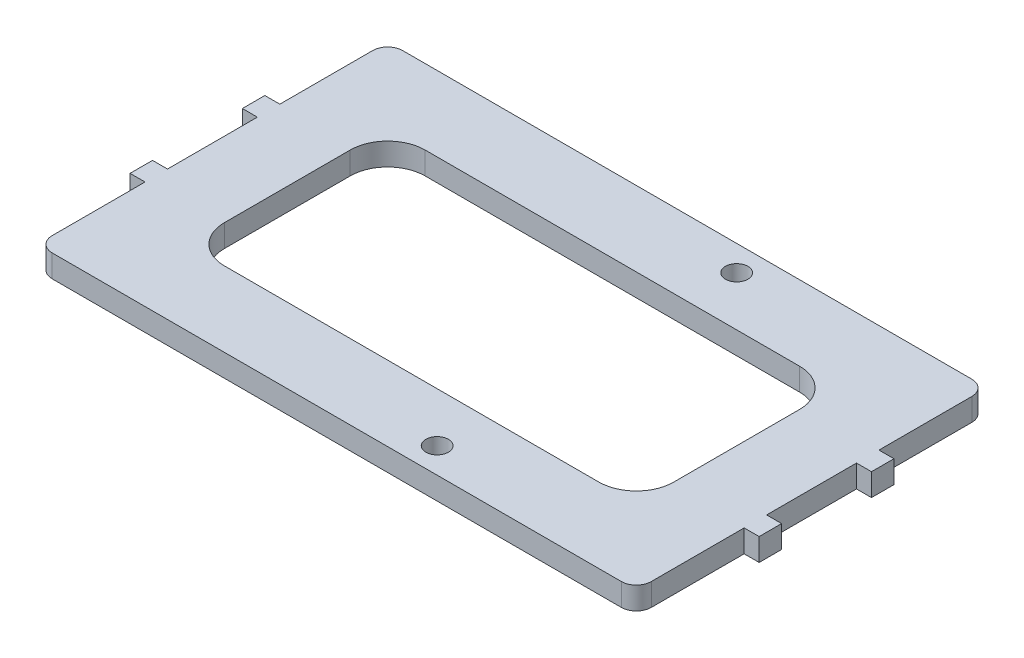
ISO-10303-21;
HEADER;
FILE_DESCRIPTION(('STEP AP214'),'2;1');
FILE_NAME('part.step','',(''),(''),'','','');
FILE_SCHEMA(('AUTOMOTIVE_DESIGN { 1 0 10303 214 1 1 1 1 }'));
ENDSEC;
DATA;
#1=APPLICATION_CONTEXT('core data for automotive mechanical design processes');
#2=APPLICATION_PROTOCOL_DEFINITION('international standard','automotive_design',2000,#1);
#3=PRODUCT_CONTEXT('',#1,'mechanical');
#4=PRODUCT('Part','Part','',(#3));
#5=PRODUCT_RELATED_PRODUCT_CATEGORY('part','',(#4));
#6=PRODUCT_DEFINITION_FORMATION('','',#4);
#7=PRODUCT_DEFINITION_CONTEXT('part definition',#1,'design');
#8=PRODUCT_DEFINITION('design','',#6,#7);
#9=PRODUCT_DEFINITION_SHAPE('','',#8);
#10=(LENGTH_UNIT() NAMED_UNIT(*) SI_UNIT(.MILLI.,.METRE.));
#11=(NAMED_UNIT(*) PLANE_ANGLE_UNIT() SI_UNIT($,.RADIAN.));
#12=(NAMED_UNIT(*) SI_UNIT($,.STERADIAN.) SOLID_ANGLE_UNIT());
#13=UNCERTAINTY_MEASURE_WITH_UNIT(LENGTH_MEASURE(1.E-05),#10,'distance_accuracy_value','');
#14=(GEOMETRIC_REPRESENTATION_CONTEXT(3) GLOBAL_UNCERTAINTY_ASSIGNED_CONTEXT((#13)) GLOBAL_UNIT_ASSIGNED_CONTEXT((#10,
#11,#12)) REPRESENTATION_CONTEXT('',''));
#15=CARTESIAN_POINT('',(0.,0.,0.));
#16=DIRECTION('',(0.,0.,1.));
#17=DIRECTION('',(1.,0.,0.));
#18=AXIS2_PLACEMENT_3D('',#15,#16,#17);
#19=CARTESIAN_POINT('',(101.6,3.81,0.));
#20=DIRECTION('',(-1.,0.,0.));
#21=DIRECTION('',(0.,0.,1.));
#22=AXIS2_PLACEMENT_3D('',#19,#20,#21);
#23=PLANE('',#22);
#24=DIRECTION('',(0.,0.,-1.));
#25=VECTOR('',#24,1.);
#26=CARTESIAN_POINT('',(101.6,0.,0.));
#27=LINE('',#26,#25);
#28=CARTESIAN_POINT('',(101.6,0.,-22.098));
#29=VERTEX_POINT('',#28);
#30=CARTESIAN_POINT('',(101.6,0.,-37.338));
#31=VERTEX_POINT('',#30);
#32=EDGE_CURVE('E532',#29,#31,#27,.T.);
#33=ORIENTED_EDGE('',*,*,#32,.T.);
#34=DIRECTION('',(0.,1.,0.));
#35=VECTOR('',#34,1.);
#36=CARTESIAN_POINT('',(101.6,0.,-37.338));
#37=LINE('',#36,#35);
#38=CARTESIAN_POINT('',(101.6,3.81,-37.338));
#39=VERTEX_POINT('',#38);
#40=EDGE_CURVE('E328',#31,#39,#37,.T.);
#41=ORIENTED_EDGE('',*,*,#40,.T.);
#42=DIRECTION('',(0.,0.,-1.));
#43=VECTOR('',#42,1.);
#44=CARTESIAN_POINT('',(101.6,3.81,0.));
#45=LINE('',#44,#43);
#46=CARTESIAN_POINT('',(101.6,3.81,-22.098));
#47=VERTEX_POINT('',#46);
#48=EDGE_CURVE('E514',#47,#39,#45,.T.);
#49=ORIENTED_EDGE('',*,*,#48,.F.);
#50=DIRECTION('',(0.,-1.,0.));
#51=VECTOR('',#50,1.);
#52=CARTESIAN_POINT('',(101.6,0.,-22.098));
#53=LINE('',#52,#51);
#54=EDGE_CURVE('E390',#47,#29,#53,.T.);
#55=ORIENTED_EDGE('',*,*,#54,.T.);
#56=EDGE_LOOP('',(#33,#41,#49,#55));
#57=FACE_BOUND('',#56,.T.);
#58=ADVANCED_FACE('F39',(#57),#23,.F.);
#59=CARTESIAN_POINT('',(101.6,0.,-2.54));
#60=VERTEX_POINT('',#59);
#61=CARTESIAN_POINT('',(101.6,0.,-18.288));
#62=VERTEX_POINT('',#61);
#63=EDGE_CURVE('E528',#60,#62,#27,.T.);
#64=ORIENTED_EDGE('',*,*,#63,.T.);
#65=DIRECTION('',(0.,1.,0.));
#66=VECTOR('',#65,1.);
#67=CARTESIAN_POINT('',(101.6,0.,-18.288));
#68=LINE('',#67,#66);
#69=CARTESIAN_POINT('',(101.6,3.81,-18.288));
#70=VERTEX_POINT('',#69);
#71=EDGE_CURVE('E384',#62,#70,#68,.T.);
#72=ORIENTED_EDGE('',*,*,#71,.T.);
#73=CARTESIAN_POINT('',(101.6,3.81,-2.54));
#74=VERTEX_POINT('',#73);
#75=EDGE_CURVE('E509',#74,#70,#45,.T.);
#76=ORIENTED_EDGE('',*,*,#75,.F.);
#77=DIRECTION('',(0.,-1.,0.));
#78=VECTOR('',#77,1.);
#79=CARTESIAN_POINT('',(101.6,3.81,-2.54));
#80=LINE('',#79,#78);
#81=EDGE_CURVE('E48',#74,#60,#80,.T.);
#82=ORIENTED_EDGE('',*,*,#81,.T.);
#83=EDGE_LOOP('',(#64,#72,#76,#82));
#84=FACE_BOUND('',#83,.T.);
#85=ADVANCED_FACE('F588',(#84),#23,.F.);
#86=CARTESIAN_POINT('',(0.,3.81,0.));
#87=DIRECTION('',(1.,0.,0.));
#88=DIRECTION('',(0.,0.,-1.));
#89=AXIS2_PLACEMENT_3D('',#86,#87,#88);
#90=PLANE('',#89);
#91=DIRECTION('',(0.,1.,0.));
#92=VECTOR('',#91,1.);
#93=CARTESIAN_POINT('',(0.,0.,-37.338));
#94=LINE('',#93,#92);
#95=CARTESIAN_POINT('',(0.,0.,-37.338));
#96=VERTEX_POINT('',#95);
#97=CARTESIAN_POINT('',(0.,3.81,-37.338));
#98=VERTEX_POINT('',#97);
#99=EDGE_CURVE('E423',#96,#98,#94,.T.);
#100=ORIENTED_EDGE('',*,*,#99,.F.);
#101=DIRECTION('',(0.,0.,1.));
#102=VECTOR('',#101,1.);
#103=CARTESIAN_POINT('',(0.,0.,0.));
#104=LINE('',#103,#102);
#105=CARTESIAN_POINT('',(0.,0.,-22.098));
#106=VERTEX_POINT('',#105);
#107=EDGE_CURVE('E523',#96,#106,#104,.T.);
#108=ORIENTED_EDGE('',*,*,#107,.T.);
#109=DIRECTION('',(0.,-1.,0.));
#110=VECTOR('',#109,1.);
#111=CARTESIAN_POINT('',(0.,0.,-22.098));
#112=LINE('',#111,#110);
#113=CARTESIAN_POINT('',(0.,3.81,-22.098));
#114=VERTEX_POINT('',#113);
#115=EDGE_CURVE('E466',#114,#106,#112,.T.);
#116=ORIENTED_EDGE('',*,*,#115,.F.);
#117=DIRECTION('',(0.,0.,1.));
#118=VECTOR('',#117,1.);
#119=CARTESIAN_POINT('',(0.,3.81,0.));
#120=LINE('',#119,#118);
#121=EDGE_CURVE('E503',#98,#114,#120,.T.);
#122=ORIENTED_EDGE('',*,*,#121,.F.);
#123=EDGE_LOOP('',(#100,#108,#116,#122));
#124=FACE_BOUND('',#123,.T.);
#125=ADVANCED_FACE('F617',(#124),#90,.F.);
#126=DIRECTION('',(0.,-1.,0.));
#127=VECTOR('',#126,1.);
#128=CARTESIAN_POINT('',(0.,0.,-41.148));
#129=LINE('',#128,#127);
#130=CARTESIAN_POINT('',(0.,3.81,-41.148));
#131=VERTEX_POINT('',#130);
#132=CARTESIAN_POINT('',(0.,0.,-41.148));
#133=VERTEX_POINT('',#132);
#134=EDGE_CURVE('E429',#131,#133,#129,.T.);
#135=ORIENTED_EDGE('',*,*,#134,.F.);
#136=CARTESIAN_POINT('',(0.,3.81,-56.896));
#137=VERTEX_POINT('',#136);
#138=EDGE_CURVE('E498',#137,#131,#120,.T.);
#139=ORIENTED_EDGE('',*,*,#138,.F.);
#140=DIRECTION('',(0.,-1.,0.));
#141=VECTOR('',#140,1.);
#142=CARTESIAN_POINT('',(0.,3.81,-56.896));
#143=LINE('',#142,#141);
#144=CARTESIAN_POINT('',(0.,0.,-56.896));
#145=VERTEX_POINT('',#144);
#146=EDGE_CURVE('E556',#137,#145,#143,.T.);
#147=ORIENTED_EDGE('',*,*,#146,.T.);
#148=EDGE_CURVE('E519',#145,#133,#104,.T.);
#149=ORIENTED_EDGE('',*,*,#148,.T.);
#150=EDGE_LOOP('',(#135,#139,#147,#149));
#151=FACE_BOUND('',#150,.T.);
#152=ADVANCED_FACE('F941',(#151),#90,.F.);
#153=DIRECTION('',(0.,1.,0.));
#154=VECTOR('',#153,1.);
#155=CARTESIAN_POINT('',(0.,0.,-18.288));
#156=LINE('',#155,#154);
#157=CARTESIAN_POINT('',(0.,0.,-18.288));
#158=VERTEX_POINT('',#157);
#159=CARTESIAN_POINT('',(0.,3.81,-18.288));
#160=VERTEX_POINT('',#159);
#161=EDGE_CURVE('E460',#158,#160,#156,.T.);
#162=ORIENTED_EDGE('',*,*,#161,.F.);
#163=CARTESIAN_POINT('',(0.,0.,-2.54));
#164=VERTEX_POINT('',#163);
#165=EDGE_CURVE('E497',#158,#164,#104,.T.);
#166=ORIENTED_EDGE('',*,*,#165,.T.);
#167=DIRECTION('',(0.,-1.,0.));
#168=VECTOR('',#167,1.);
#169=CARTESIAN_POINT('',(0.,3.81,-2.54));
#170=LINE('',#169,#168);
#171=CARTESIAN_POINT('',(0.,3.81,-2.54));
#172=VERTEX_POINT('',#171);
#173=EDGE_CURVE('E560',#164,#172,#170,.F.);
#174=ORIENTED_EDGE('',*,*,#173,.T.);
#175=EDGE_CURVE('E504',#160,#172,#120,.T.);
#176=ORIENTED_EDGE('',*,*,#175,.F.);
#177=EDGE_LOOP('',(#162,#166,#174,#176));
#178=FACE_BOUND('',#177,.T.);
#179=ADVANCED_FACE('F611',(#178),#90,.F.);
#180=CARTESIAN_POINT('',(0.,3.81,0.));
#181=DIRECTION('',(0.,0.,-1.));
#182=DIRECTION('',(-1.,0.,0.));
#183=AXIS2_PLACEMENT_3D('',#180,#181,#182);
#184=PLANE('',#183);
#185=DIRECTION('',(1.,0.,0.));
#186=VECTOR('',#185,1.);
#187=CARTESIAN_POINT('',(0.,3.81,0.));
#188=LINE('',#187,#186);
#189=CARTESIAN_POINT('',(2.54,3.81,0.));
#190=VERTEX_POINT('',#189);
#191=CARTESIAN_POINT('',(99.06,3.81,0.));
#192=VERTEX_POINT('',#191);
#193=EDGE_CURVE('E502',#190,#192,#188,.T.);
#194=ORIENTED_EDGE('',*,*,#193,.F.);
#195=DIRECTION('',(0.,-1.,0.));
#196=VECTOR('',#195,1.);
#197=CARTESIAN_POINT('',(2.54,3.81,0.));
#198=LINE('',#197,#196);
#199=CARTESIAN_POINT('',(2.54,0.,0.));
#200=VERTEX_POINT('',#199);
#201=EDGE_CURVE('E538',#190,#200,#198,.T.);
#202=ORIENTED_EDGE('',*,*,#201,.T.);
#203=DIRECTION('',(1.,0.,0.));
#204=VECTOR('',#203,1.);
#205=CARTESIAN_POINT('',(0.,0.,0.));
#206=LINE('',#205,#204);
#207=CARTESIAN_POINT('',(99.06,0.,0.));
#208=VERTEX_POINT('',#207);
#209=EDGE_CURVE('E522',#200,#208,#206,.T.);
#210=ORIENTED_EDGE('',*,*,#209,.T.);
#211=DIRECTION('',(0.,-1.,0.));
#212=VECTOR('',#211,1.);
#213=CARTESIAN_POINT('',(99.06,3.81,0.));
#214=LINE('',#213,#212);
#215=EDGE_CURVE('E518',#208,#192,#214,.F.);
#216=ORIENTED_EDGE('',*,*,#215,.T.);
#217=EDGE_LOOP('',(#194,#202,#210,#216));
#218=FACE_BOUND('',#217,.T.);
#219=ADVANCED_FACE('F602',(#218),#184,.F.);
#220=CARTESIAN_POINT('',(101.6,3.81,-41.148));
#221=VERTEX_POINT('',#220);
#222=CARTESIAN_POINT('',(101.6,3.81,-56.896));
#223=VERTEX_POINT('',#222);
#224=EDGE_CURVE('E508',#221,#223,#45,.T.);
#225=ORIENTED_EDGE('',*,*,#224,.F.);
#226=DIRECTION('',(0.,-1.,0.));
#227=VECTOR('',#226,1.);
#228=CARTESIAN_POINT('',(101.6,0.,-41.148));
#229=LINE('',#228,#227);
#230=CARTESIAN_POINT('',(101.6,0.,-41.148));
#231=VERTEX_POINT('',#230);
#232=EDGE_CURVE('E351',#221,#231,#229,.T.);
#233=ORIENTED_EDGE('',*,*,#232,.T.);
#234=CARTESIAN_POINT('',(101.6,0.,-56.896));
#235=VERTEX_POINT('',#234);
#236=EDGE_CURVE('E527',#231,#235,#27,.T.);
#237=ORIENTED_EDGE('',*,*,#236,.T.);
#238=DIRECTION('',(0.,-1.,0.));
#239=VECTOR('',#238,1.);
#240=CARTESIAN_POINT('',(101.6,3.81,-56.896));
#241=LINE('',#240,#239);
#242=EDGE_CURVE('E11',#235,#223,#241,.F.);
#243=ORIENTED_EDGE('',*,*,#242,.T.);
#244=EDGE_LOOP('',(#225,#233,#237,#243));
#245=FACE_BOUND('',#244,.T.);
#246=ADVANCED_FACE('F646',(#245),#23,.F.);
#247=CARTESIAN_POINT('',(0.,3.81,-59.436));
#248=DIRECTION('',(0.,0.,1.));
#249=DIRECTION('',(1.,0.,0.));
#250=AXIS2_PLACEMENT_3D('',#247,#248,#249);
#251=PLANE('',#250);
#252=DIRECTION('',(-1.,0.,0.));
#253=VECTOR('',#252,1.);
#254=CARTESIAN_POINT('',(0.,0.,-59.436));
#255=LINE('',#254,#253);
#256=CARTESIAN_POINT('',(99.06,0.,-59.436));
#257=VERTEX_POINT('',#256);
#258=CARTESIAN_POINT('',(2.54,0.,-59.436));
#259=VERTEX_POINT('',#258);
#260=EDGE_CURVE('E531',#257,#259,#255,.T.);
#261=ORIENTED_EDGE('',*,*,#260,.T.);
#262=DIRECTION('',(0.,-1.,0.));
#263=VECTOR('',#262,1.);
#264=CARTESIAN_POINT('',(2.54,3.81,-59.436));
#265=LINE('',#264,#263);
#266=CARTESIAN_POINT('',(2.54,3.81,-59.436));
#267=VERTEX_POINT('',#266);
#268=EDGE_CURVE('E580',#259,#267,#265,.F.);
#269=ORIENTED_EDGE('',*,*,#268,.T.);
#270=DIRECTION('',(-1.,0.,0.));
#271=VECTOR('',#270,1.);
#272=CARTESIAN_POINT('',(0.,3.81,-59.436));
#273=LINE('',#272,#271);
#274=CARTESIAN_POINT('',(99.06,3.81,-59.436));
#275=VERTEX_POINT('',#274);
#276=EDGE_CURVE('E513',#275,#267,#273,.T.);
#277=ORIENTED_EDGE('',*,*,#276,.F.);
#278=DIRECTION('',(0.,-1.,0.));
#279=VECTOR('',#278,1.);
#280=CARTESIAN_POINT('',(99.06,3.81,-59.436));
#281=LINE('',#280,#279);
#282=EDGE_CURVE('E576',#275,#257,#281,.T.);
#283=ORIENTED_EDGE('',*,*,#282,.T.);
#284=EDGE_LOOP('',(#261,#269,#277,#283));
#285=FACE_BOUND('',#284,.T.);
#286=ADVANCED_FACE('F653',(#285),#251,.F.);
#287=CARTESIAN_POINT('',(0.,3.81,0.));
#288=DIRECTION('',(0.,-1.,0.));
#289=DIRECTION('',(0.,0.,-1.));
#290=AXIS2_PLACEMENT_3D('',#287,#288,#289);
#291=PLANE('',#290);
#292=CARTESIAN_POINT('',(63.5,3.81,-4.318));
#293=DIRECTION('',(0.,1.,0.));
#294=DIRECTION('',(0.,0.,1.));
#295=AXIS2_PLACEMENT_3D('',#292,#293,#294);
#296=CIRCLE('',#295,1.90500000000001);
#297=CARTESIAN_POINT('',(63.5,3.81,-2.41299999999999));
#298=VERTEX_POINT('',#297);
#299=EDGE_CURVE('E883',#298,#298,#296,.T.);
#300=ORIENTED_EDGE('',*,*,#299,.F.);
#301=EDGE_LOOP('',(#300));
#302=FACE_BOUND('',#301,.T.);
#303=CARTESIAN_POINT('',(63.5,3.81,-55.118));
#304=DIRECTION('',(0.,1.,0.));
#305=DIRECTION('',(0.,0.,1.));
#306=AXIS2_PLACEMENT_3D('',#303,#304,#305);
#307=CIRCLE('',#306,1.90500000000001);
#308=CARTESIAN_POINT('',(63.5,3.81,-53.213));
#309=VERTEX_POINT('',#308);
#310=EDGE_CURVE('E278',#309,#309,#307,.T.);
#311=ORIENTED_EDGE('',*,*,#310,.F.);
#312=EDGE_LOOP('',(#311));
#313=FACE_BOUND('',#312,.T.);
#314=DIRECTION('',(0.,0.,1.));
#315=VECTOR('',#314,1.);
#316=CARTESIAN_POINT('',(88.9,3.81,-19.05));
#317=LINE('',#316,#315);
#318=CARTESIAN_POINT('',(88.9,3.81,-40.386));
#319=VERTEX_POINT('',#318);
#320=CARTESIAN_POINT('',(88.9,3.81,-19.05));
#321=VERTEX_POINT('',#320);
#322=EDGE_CURVE('E258',#319,#321,#317,.T.);
#323=ORIENTED_EDGE('',*,*,#322,.T.);
#324=CARTESIAN_POINT('',(82.55,3.81,-19.05));
#325=DIRECTION('',(0.,-1.,0.));
#326=DIRECTION('',(0.,0.,1.));
#327=AXIS2_PLACEMENT_3D('',#324,#325,#326);
#328=CIRCLE('',#327,6.35);
#329=CARTESIAN_POINT('',(82.5499999999999,3.81,-12.7));
#330=VERTEX_POINT('',#329);
#331=EDGE_CURVE('E251',#321,#330,#328,.T.);
#332=ORIENTED_EDGE('',*,*,#331,.T.);
#333=DIRECTION('',(-1.,0.,0.));
#334=VECTOR('',#333,1.);
#335=CARTESIAN_POINT('',(19.05,3.81,-12.7));
#336=LINE('',#335,#334);
#337=CARTESIAN_POINT('',(19.05,3.81,-12.7));
#338=VERTEX_POINT('',#337);
#339=EDGE_CURVE('E261',#330,#338,#336,.T.);
#340=ORIENTED_EDGE('',*,*,#339,.T.);
#341=CARTESIAN_POINT('',(19.05,3.81,-19.05));
#342=DIRECTION('',(0.,-1.,0.));
#343=DIRECTION('',(0.,0.,-1.));
#344=AXIS2_PLACEMENT_3D('',#341,#342,#343);
#345=CIRCLE('',#344,6.35);
#346=CARTESIAN_POINT('',(12.7,3.81,-19.05));
#347=VERTEX_POINT('',#346);
#348=EDGE_CURVE('E55',#338,#347,#345,.T.);
#349=ORIENTED_EDGE('',*,*,#348,.T.);
#350=DIRECTION('',(0.,0.,-1.));
#351=VECTOR('',#350,1.);
#352=CARTESIAN_POINT('',(12.7,3.81,-19.05));
#353=LINE('',#352,#351);
#354=CARTESIAN_POINT('',(12.7,3.81,-40.386));
#355=VERTEX_POINT('',#354);
#356=EDGE_CURVE('E283',#347,#355,#353,.T.);
#357=ORIENTED_EDGE('',*,*,#356,.T.);
#358=CARTESIAN_POINT('',(19.05,3.81,-40.386));
#359=DIRECTION('',(0.,-1.,0.));
#360=DIRECTION('',(0.,0.,-1.));
#361=AXIS2_PLACEMENT_3D('',#358,#359,#360);
#362=CIRCLE('',#361,6.35);
#363=CARTESIAN_POINT('',(19.05,3.81,-46.736));
#364=VERTEX_POINT('',#363);
#365=EDGE_CURVE('E287',#355,#364,#362,.T.);
#366=ORIENTED_EDGE('',*,*,#365,.T.);
#367=DIRECTION('',(1.,0.,0.));
#368=VECTOR('',#367,1.);
#369=CARTESIAN_POINT('',(19.05,3.81,-46.736));
#370=LINE('',#369,#368);
#371=CARTESIAN_POINT('',(82.5499999999999,3.81,-46.736));
#372=VERTEX_POINT('',#371);
#373=EDGE_CURVE('E291',#364,#372,#370,.T.);
#374=ORIENTED_EDGE('',*,*,#373,.T.);
#375=CARTESIAN_POINT('',(82.55,3.81,-40.386));
#376=DIRECTION('',(0.,-1.,0.));
#377=DIRECTION('',(0.,0.,-1.));
#378=AXIS2_PLACEMENT_3D('',#375,#376,#377);
#379=CIRCLE('',#378,6.34999999999999);
#380=EDGE_CURVE('E295',#372,#319,#379,.T.);
#381=ORIENTED_EDGE('',*,*,#380,.T.);
#382=EDGE_LOOP('',(#323,#332,#340,#349,#357,#366,#374,#381));
#383=FACE_BOUND('',#382,.T.);
#384=ORIENTED_EDGE('',*,*,#138,.T.);
#385=DIRECTION('',(1.,0.,0.));
#386=VECTOR('',#385,1.);
#387=CARTESIAN_POINT('',(-2.54,3.81,-41.148));
#388=LINE('',#387,#386);
#389=CARTESIAN_POINT('',(-2.54,3.81,-41.148));
#390=VERTEX_POINT('',#389);
#391=EDGE_CURVE('E452',#390,#131,#388,.T.);
#392=ORIENTED_EDGE('',*,*,#391,.F.);
#393=DIRECTION('',(0.,0.,-1.));
#394=VECTOR('',#393,1.);
#395=CARTESIAN_POINT('',(-2.54,3.81,-41.148));
#396=LINE('',#395,#394);
#397=CARTESIAN_POINT('',(-2.54,3.81,-37.338));
#398=VERTEX_POINT('',#397);
#399=EDGE_CURVE('E428',#398,#390,#396,.T.);
#400=ORIENTED_EDGE('',*,*,#399,.F.);
#401=DIRECTION('',(1.,0.,0.));
#402=VECTOR('',#401,1.);
#403=CARTESIAN_POINT('',(-2.54,3.81,-37.338));
#404=LINE('',#403,#402);
#405=EDGE_CURVE('E456',#398,#98,#404,.T.);
#406=ORIENTED_EDGE('',*,*,#405,.T.);
#407=ORIENTED_EDGE('',*,*,#121,.T.);
#408=DIRECTION('',(1.,0.,0.));
#409=VECTOR('',#408,1.);
#410=CARTESIAN_POINT('',(-2.54,3.81,-22.098));
#411=LINE('',#410,#409);
#412=CARTESIAN_POINT('',(-2.54,3.81,-22.098));
#413=VERTEX_POINT('',#412);
#414=EDGE_CURVE('E489',#413,#114,#411,.T.);
#415=ORIENTED_EDGE('',*,*,#414,.F.);
#416=DIRECTION('',(0.,0.,-1.));
#417=VECTOR('',#416,1.);
#418=CARTESIAN_POINT('',(-2.54,3.81,-18.288));
#419=LINE('',#418,#417);
#420=CARTESIAN_POINT('',(-2.54,3.81,-18.288));
#421=VERTEX_POINT('',#420);
#422=EDGE_CURVE('E465',#421,#413,#419,.T.);
#423=ORIENTED_EDGE('',*,*,#422,.F.);
#424=DIRECTION('',(1.,0.,0.));
#425=VECTOR('',#424,1.);
#426=CARTESIAN_POINT('',(-2.54,3.81,-18.288));
#427=LINE('',#426,#425);
#428=EDGE_CURVE('E493',#421,#160,#427,.T.);
#429=ORIENTED_EDGE('',*,*,#428,.T.);
#430=ORIENTED_EDGE('',*,*,#175,.T.);
#431=CARTESIAN_POINT('',(2.54,3.81,-2.54));
#432=DIRECTION('',(0.,-1.,0.));
#433=DIRECTION('',(0.,0.,-1.));
#434=AXIS2_PLACEMENT_3D('',#431,#432,#433);
#435=CIRCLE('',#434,2.54);
#436=EDGE_CURVE('E573',#172,#190,#435,.F.);
#437=ORIENTED_EDGE('',*,*,#436,.T.);
#438=ORIENTED_EDGE('',*,*,#193,.T.);
#439=CARTESIAN_POINT('',(99.06,3.81,-2.54));
#440=DIRECTION('',(0.,-1.,0.));
#441=DIRECTION('',(0.,0.,-1.));
#442=AXIS2_PLACEMENT_3D('',#439,#440,#441);
#443=CIRCLE('',#442,2.54);
#444=EDGE_CURVE('E564',#192,#74,#443,.F.);
#445=ORIENTED_EDGE('',*,*,#444,.T.);
#446=ORIENTED_EDGE('',*,*,#75,.T.);
#447=DIRECTION('',(-1.,0.,0.));
#448=VECTOR('',#447,1.);
#449=CARTESIAN_POINT('',(104.14,3.81,-18.288));
#450=LINE('',#449,#448);
#451=CARTESIAN_POINT('',(104.14,3.81,-18.288));
#452=VERTEX_POINT('',#451);
#453=EDGE_CURVE('E402',#452,#70,#450,.T.);
#454=ORIENTED_EDGE('',*,*,#453,.F.);
#455=DIRECTION('',(0.,0.,-1.));
#456=VECTOR('',#455,1.);
#457=CARTESIAN_POINT('',(104.14,3.81,-18.288));
#458=LINE('',#457,#456);
#459=CARTESIAN_POINT('',(104.14,3.81,-22.098));
#460=VERTEX_POINT('',#459);
#461=EDGE_CURVE('E398',#452,#460,#458,.T.);
#462=ORIENTED_EDGE('',*,*,#461,.T.);
#463=DIRECTION('',(-1.,0.,0.));
#464=VECTOR('',#463,1.);
#465=CARTESIAN_POINT('',(104.14,3.81,-22.098));
#466=LINE('',#465,#464);
#467=EDGE_CURVE('E411',#460,#47,#466,.T.);
#468=ORIENTED_EDGE('',*,*,#467,.T.);
#469=ORIENTED_EDGE('',*,*,#48,.T.);
#470=DIRECTION('',(-1.,0.,0.));
#471=VECTOR('',#470,1.);
#472=CARTESIAN_POINT('',(104.14,3.81,-37.338));
#473=LINE('',#472,#471);
#474=CARTESIAN_POINT('',(104.14,3.81,-37.338));
#475=VERTEX_POINT('',#474);
#476=EDGE_CURVE('E363',#475,#39,#473,.T.);
#477=ORIENTED_EDGE('',*,*,#476,.F.);
#478=DIRECTION('',(0.,0.,-1.));
#479=VECTOR('',#478,1.);
#480=CARTESIAN_POINT('',(104.14,3.81,-41.148));
#481=LINE('',#480,#479);
#482=CARTESIAN_POINT('',(104.14,3.81,-41.148));
#483=VERTEX_POINT('',#482);
#484=EDGE_CURVE('E359',#475,#483,#481,.T.);
#485=ORIENTED_EDGE('',*,*,#484,.T.);
#486=DIRECTION('',(-1.,0.,0.));
#487=VECTOR('',#486,1.);
#488=CARTESIAN_POINT('',(104.14,3.81,-41.148));
#489=LINE('',#488,#487);
#490=EDGE_CURVE('E372',#483,#221,#489,.T.);
#491=ORIENTED_EDGE('',*,*,#490,.T.);
#492=ORIENTED_EDGE('',*,*,#224,.T.);
#493=CARTESIAN_POINT('',(99.06,3.81,-56.896));
#494=DIRECTION('',(0.,-1.,0.));
#495=DIRECTION('',(0.,0.,-1.));
#496=AXIS2_PLACEMENT_3D('',#493,#494,#495);
#497=CIRCLE('',#496,2.54);
#498=EDGE_CURVE('E567',#223,#275,#497,.F.);
#499=ORIENTED_EDGE('',*,*,#498,.T.);
#500=ORIENTED_EDGE('',*,*,#276,.T.);
#501=CARTESIAN_POINT('',(2.54,3.81,-56.896));
#502=DIRECTION('',(0.,-1.,0.));
#503=DIRECTION('',(0.,0.,-1.));
#504=AXIS2_PLACEMENT_3D('',#501,#502,#503);
#505=CIRCLE('',#504,2.54);
#506=EDGE_CURVE('E570',#267,#137,#505,.F.);
#507=ORIENTED_EDGE('',*,*,#506,.T.);
#508=EDGE_LOOP('',(#384,#392,#400,#406,#407,#415,#423,#429,#430,#437,#438,#445,#446,#454,#462,
#468,#469,#477,#485,#491,#492,#499,#500,#507));
#509=FACE_BOUND('',#508,.T.);
#510=ADVANCED_FACE('F266',(#302,#313,#383,#509),#291,.F.);
#511=CARTESIAN_POINT('',(0.,0.,0.));
#512=DIRECTION('',(0.,-1.,0.));
#513=DIRECTION('',(0.,0.,-1.));
#514=AXIS2_PLACEMENT_3D('',#511,#512,#513);
#515=PLANE('',#514);
#516=CARTESIAN_POINT('',(63.5,0.,-4.318));
#517=DIRECTION('',(0.,1.,0.));
#518=DIRECTION('',(0.,0.,1.));
#519=AXIS2_PLACEMENT_3D('',#516,#517,#518);
#520=CIRCLE('',#519,1.90500000000001);
#521=CARTESIAN_POINT('',(63.5,0.,-2.41299999999999));
#522=VERTEX_POINT('',#521);
#523=EDGE_CURVE('E303',#522,#522,#520,.T.);
#524=ORIENTED_EDGE('',*,*,#523,.T.);
#525=EDGE_LOOP('',(#524));
#526=FACE_BOUND('',#525,.T.);
#527=CARTESIAN_POINT('',(63.5,0.,-55.118));
#528=DIRECTION('',(0.,1.,0.));
#529=DIRECTION('',(0.,0.,1.));
#530=AXIS2_PLACEMENT_3D('',#527,#528,#529);
#531=CIRCLE('',#530,1.90500000000001);
#532=CARTESIAN_POINT('',(63.5,0.,-53.213));
#533=VERTEX_POINT('',#532);
#534=EDGE_CURVE('E885',#533,#533,#531,.T.);
#535=ORIENTED_EDGE('',*,*,#534,.T.);
#536=EDGE_LOOP('',(#535));
#537=FACE_BOUND('',#536,.T.);
#538=CARTESIAN_POINT('',(82.55,0.,-19.05));
#539=DIRECTION('',(0.,-1.,0.));
#540=DIRECTION('',(0.,0.,1.));
#541=AXIS2_PLACEMENT_3D('',#538,#539,#540);
#542=CIRCLE('',#541,6.35);
#543=CARTESIAN_POINT('',(88.9,0.,-19.05));
#544=VERTEX_POINT('',#543);
#545=CARTESIAN_POINT('',(82.5499999999999,0.,-12.7));
#546=VERTEX_POINT('',#545);
#547=EDGE_CURVE('E63',#544,#546,#542,.T.);
#548=ORIENTED_EDGE('',*,*,#547,.F.);
#549=DIRECTION('',(0.,0.,1.));
#550=VECTOR('',#549,1.);
#551=CARTESIAN_POINT('',(88.9,0.,-19.05));
#552=LINE('',#551,#550);
#553=CARTESIAN_POINT('',(88.9,0.,-40.386));
#554=VERTEX_POINT('',#553);
#555=EDGE_CURVE('E271',#554,#544,#552,.T.);
#556=ORIENTED_EDGE('',*,*,#555,.F.);
#557=CARTESIAN_POINT('',(82.55,0.,-40.386));
#558=DIRECTION('',(0.,-1.,0.));
#559=DIRECTION('',(0.,0.,-1.));
#560=AXIS2_PLACEMENT_3D('',#557,#558,#559);
#561=CIRCLE('',#560,6.34999999999999);
#562=CARTESIAN_POINT('',(82.5499999999999,0.,-46.736));
#563=VERTEX_POINT('',#562);
#564=EDGE_CURVE('E275',#563,#554,#561,.T.);
#565=ORIENTED_EDGE('',*,*,#564,.F.);
#566=DIRECTION('',(1.,0.,0.));
#567=VECTOR('',#566,1.);
#568=CARTESIAN_POINT('',(19.05,0.,-46.736));
#569=LINE('',#568,#567);
#570=CARTESIAN_POINT('',(19.05,0.,-46.736));
#571=VERTEX_POINT('',#570);
#572=EDGE_CURVE('E318',#571,#563,#569,.T.);
#573=ORIENTED_EDGE('',*,*,#572,.F.);
#574=CARTESIAN_POINT('',(19.05,0.,-40.386));
#575=DIRECTION('',(0.,-1.,0.));
#576=DIRECTION('',(0.,0.,-1.));
#577=AXIS2_PLACEMENT_3D('',#574,#575,#576);
#578=CIRCLE('',#577,6.35);
#579=CARTESIAN_POINT('',(12.7,0.,-40.386));
#580=VERTEX_POINT('',#579);
#581=EDGE_CURVE('E314',#580,#571,#578,.T.);
#582=ORIENTED_EDGE('',*,*,#581,.F.);
#583=DIRECTION('',(0.,0.,-1.));
#584=VECTOR('',#583,1.);
#585=CARTESIAN_POINT('',(12.7,0.,-19.05));
#586=LINE('',#585,#584);
#587=CARTESIAN_POINT('',(12.7,0.,-19.05));
#588=VERTEX_POINT('',#587);
#589=EDGE_CURVE('E310',#588,#580,#586,.T.);
#590=ORIENTED_EDGE('',*,*,#589,.F.);
#591=CARTESIAN_POINT('',(19.05,0.,-19.05));
#592=DIRECTION('',(0.,-1.,0.));
#593=DIRECTION('',(0.,0.,-1.));
#594=AXIS2_PLACEMENT_3D('',#591,#592,#593);
#595=CIRCLE('',#594,6.35);
#596=CARTESIAN_POINT('',(19.05,0.,-12.7));
#597=VERTEX_POINT('',#596);
#598=EDGE_CURVE('E306',#597,#588,#595,.T.);
#599=ORIENTED_EDGE('',*,*,#598,.F.);
#600=DIRECTION('',(-1.,0.,0.));
#601=VECTOR('',#600,1.);
#602=CARTESIAN_POINT('',(19.05,0.,-12.7));
#603=LINE('',#602,#601);
#604=EDGE_CURVE('E302',#546,#597,#603,.T.);
#605=ORIENTED_EDGE('',*,*,#604,.F.);
#606=EDGE_LOOP('',(#548,#556,#565,#573,#582,#590,#599,#605));
#607=FACE_BOUND('',#606,.T.);
#608=ORIENTED_EDGE('',*,*,#209,.F.);
#609=CARTESIAN_POINT('',(2.54,0.,-2.54));
#610=DIRECTION('',(0.,-1.,0.));
#611=DIRECTION('',(0.,0.,-1.));
#612=AXIS2_PLACEMENT_3D('',#609,#610,#611);
#613=CIRCLE('',#612,2.54);
#614=EDGE_CURVE('E552',#200,#164,#613,.T.);
#615=ORIENTED_EDGE('',*,*,#614,.T.);
#616=ORIENTED_EDGE('',*,*,#165,.F.);
#617=DIRECTION('',(1.,0.,0.));
#618=VECTOR('',#617,1.);
#619=CARTESIAN_POINT('',(-2.54,0.,-18.288));
#620=LINE('',#619,#618);
#621=CARTESIAN_POINT('',(-2.54,0.,-18.288));
#622=VERTEX_POINT('',#621);
#623=EDGE_CURVE('E475',#622,#158,#620,.T.);
#624=ORIENTED_EDGE('',*,*,#623,.F.);
#625=DIRECTION('',(0.,0.,1.));
#626=VECTOR('',#625,1.);
#627=CARTESIAN_POINT('',(-2.54,0.,-18.288));
#628=LINE('',#627,#626);
#629=CARTESIAN_POINT('',(-2.54,0.,-22.098));
#630=VERTEX_POINT('',#629);
#631=EDGE_CURVE('E472',#630,#622,#628,.T.);
#632=ORIENTED_EDGE('',*,*,#631,.F.);
#633=DIRECTION('',(1.,0.,0.));
#634=VECTOR('',#633,1.);
#635=CARTESIAN_POINT('',(-2.54,0.,-22.098));
#636=LINE('',#635,#634);
#637=EDGE_CURVE('E485',#630,#106,#636,.T.);
#638=ORIENTED_EDGE('',*,*,#637,.T.);
#639=ORIENTED_EDGE('',*,*,#107,.F.);
#640=DIRECTION('',(1.,0.,0.));
#641=VECTOR('',#640,1.);
#642=CARTESIAN_POINT('',(-2.54,0.,-37.338));
#643=LINE('',#642,#641);
#644=CARTESIAN_POINT('',(-2.54,0.,-37.338));
#645=VERTEX_POINT('',#644);
#646=EDGE_CURVE('E438',#645,#96,#643,.T.);
#647=ORIENTED_EDGE('',*,*,#646,.F.);
#648=DIRECTION('',(0.,0.,1.));
#649=VECTOR('',#648,1.);
#650=CARTESIAN_POINT('',(-2.54,0.,-41.148));
#651=LINE('',#650,#649);
#652=CARTESIAN_POINT('',(-2.54,0.,-41.148));
#653=VERTEX_POINT('',#652);
#654=EDGE_CURVE('E435',#653,#645,#651,.T.);
#655=ORIENTED_EDGE('',*,*,#654,.F.);
#656=DIRECTION('',(1.,0.,0.));
#657=VECTOR('',#656,1.);
#658=CARTESIAN_POINT('',(-2.54,0.,-41.148));
#659=LINE('',#658,#657);
#660=EDGE_CURVE('E448',#653,#133,#659,.T.);
#661=ORIENTED_EDGE('',*,*,#660,.T.);
#662=ORIENTED_EDGE('',*,*,#148,.F.);
#663=CARTESIAN_POINT('',(2.54,0.,-56.896));
#664=DIRECTION('',(0.,-1.,0.));
#665=DIRECTION('',(0.,0.,-1.));
#666=AXIS2_PLACEMENT_3D('',#663,#664,#665);
#667=CIRCLE('',#666,2.54);
#668=EDGE_CURVE('E549',#145,#259,#667,.T.);
#669=ORIENTED_EDGE('',*,*,#668,.T.);
#670=ORIENTED_EDGE('',*,*,#260,.F.);
#671=CARTESIAN_POINT('',(99.06,0.,-56.896));
#672=DIRECTION('',(0.,-1.,0.));
#673=DIRECTION('',(0.,0.,-1.));
#674=AXIS2_PLACEMENT_3D('',#671,#672,#673);
#675=CIRCLE('',#674,2.54);
#676=EDGE_CURVE('E545',#257,#235,#675,.T.);
#677=ORIENTED_EDGE('',*,*,#676,.T.);
#678=ORIENTED_EDGE('',*,*,#236,.F.);
#679=DIRECTION('',(-1.,0.,0.));
#680=VECTOR('',#679,1.);
#681=CARTESIAN_POINT('',(104.14,0.,-41.148));
#682=LINE('',#681,#680);
#683=CARTESIAN_POINT('',(104.14,0.,-41.148));
#684=VERTEX_POINT('',#683);
#685=EDGE_CURVE('E376',#684,#231,#682,.T.);
#686=ORIENTED_EDGE('',*,*,#685,.F.);
#687=DIRECTION('',(0.,0.,1.));
#688=VECTOR('',#687,1.);
#689=CARTESIAN_POINT('',(104.14,0.,-41.148));
#690=LINE('',#689,#688);
#691=CARTESIAN_POINT('',(104.14,0.,-37.338));
#692=VERTEX_POINT('',#691);
#693=EDGE_CURVE('E350',#684,#692,#690,.T.);
#694=ORIENTED_EDGE('',*,*,#693,.T.);
#695=DIRECTION('',(-1.,0.,0.));
#696=VECTOR('',#695,1.);
#697=CARTESIAN_POINT('',(104.14,0.,-37.338));
#698=LINE('',#697,#696);
#699=EDGE_CURVE('E380',#692,#31,#698,.T.);
#700=ORIENTED_EDGE('',*,*,#699,.T.);
#701=ORIENTED_EDGE('',*,*,#32,.F.);
#702=DIRECTION('',(-1.,0.,0.));
#703=VECTOR('',#702,1.);
#704=CARTESIAN_POINT('',(104.14,0.,-22.098));
#705=LINE('',#704,#703);
#706=CARTESIAN_POINT('',(104.14,0.,-22.098));
#707=VERTEX_POINT('',#706);
#708=EDGE_CURVE('E415',#707,#29,#705,.T.);
#709=ORIENTED_EDGE('',*,*,#708,.F.);
#710=DIRECTION('',(0.,0.,1.));
#711=VECTOR('',#710,1.);
#712=CARTESIAN_POINT('',(104.14,0.,-18.288));
#713=LINE('',#712,#711);
#714=CARTESIAN_POINT('',(104.14,0.,-18.288));
#715=VERTEX_POINT('',#714);
#716=EDGE_CURVE('E389',#707,#715,#713,.T.);
#717=ORIENTED_EDGE('',*,*,#716,.T.);
#718=DIRECTION('',(-1.,0.,0.));
#719=VECTOR('',#718,1.);
#720=CARTESIAN_POINT('',(104.14,0.,-18.288));
#721=LINE('',#720,#719);
#722=EDGE_CURVE('E419',#715,#62,#721,.T.);
#723=ORIENTED_EDGE('',*,*,#722,.T.);
#724=ORIENTED_EDGE('',*,*,#63,.F.);
#725=CARTESIAN_POINT('',(99.06,0.,-2.54));
#726=DIRECTION('',(0.,-1.,0.));
#727=DIRECTION('',(0.,0.,-1.));
#728=AXIS2_PLACEMENT_3D('',#725,#726,#727);
#729=CIRCLE('',#728,2.54);
#730=EDGE_CURVE('E542',#60,#208,#729,.T.);
#731=ORIENTED_EDGE('',*,*,#730,.T.);
#732=EDGE_LOOP('',(#608,#615,#616,#624,#632,#638,#639,#647,#655,#661,#662,#669,#670,#677,#678,
#686,#694,#700,#701,#709,#717,#723,#724,#731));
#733=FACE_BOUND('',#732,.T.);
#734=ADVANCED_FACE('F593',(#526,#537,#607,#733),#515,.T.);
#735=CARTESIAN_POINT('',(2.54,3.81,-2.54));
#736=DIRECTION('',(0.,-1.,0.));
#737=DIRECTION('',(0.,0.,-1.));
#738=AXIS2_PLACEMENT_3D('',#735,#736,#737);
#739=CYLINDRICAL_SURFACE('',#738,2.54);
#740=ORIENTED_EDGE('',*,*,#436,.F.);
#741=ORIENTED_EDGE('',*,*,#173,.F.);
#742=ORIENTED_EDGE('',*,*,#614,.F.);
#743=ORIENTED_EDGE('',*,*,#201,.F.);
#744=EDGE_LOOP('',(#740,#741,#742,#743));
#745=FACE_BOUND('',#744,.T.);
#746=ADVANCED_FACE('F609',(#745),#739,.T.);
#747=CARTESIAN_POINT('',(2.54,3.81,-56.896));
#748=DIRECTION('',(0.,-1.,0.));
#749=DIRECTION('',(0.,0.,-1.));
#750=AXIS2_PLACEMENT_3D('',#747,#748,#749);
#751=CYLINDRICAL_SURFACE('',#750,2.54);
#752=ORIENTED_EDGE('',*,*,#506,.F.);
#753=ORIENTED_EDGE('',*,*,#268,.F.);
#754=ORIENTED_EDGE('',*,*,#668,.F.);
#755=ORIENTED_EDGE('',*,*,#146,.F.);
#756=EDGE_LOOP('',(#752,#753,#754,#755));
#757=FACE_BOUND('',#756,.T.);
#758=ADVANCED_FACE('F912',(#757),#751,.T.);
#759=CARTESIAN_POINT('',(99.06,3.81,-56.896));
#760=DIRECTION('',(0.,-1.,0.));
#761=DIRECTION('',(0.,0.,-1.));
#762=AXIS2_PLACEMENT_3D('',#759,#760,#761);
#763=CYLINDRICAL_SURFACE('',#762,2.54);
#764=ORIENTED_EDGE('',*,*,#498,.F.);
#765=ORIENTED_EDGE('',*,*,#242,.F.);
#766=ORIENTED_EDGE('',*,*,#676,.F.);
#767=ORIENTED_EDGE('',*,*,#282,.F.);
#768=EDGE_LOOP('',(#764,#765,#766,#767));
#769=FACE_BOUND('',#768,.T.);
#770=ADVANCED_FACE('F641',(#769),#763,.T.);
#771=CARTESIAN_POINT('',(99.06,3.81,-2.54));
#772=DIRECTION('',(0.,-1.,0.));
#773=DIRECTION('',(0.,0.,-1.));
#774=AXIS2_PLACEMENT_3D('',#771,#772,#773);
#775=CYLINDRICAL_SURFACE('',#774,2.54);
#776=ORIENTED_EDGE('',*,*,#444,.F.);
#777=ORIENTED_EDGE('',*,*,#215,.F.);
#778=ORIENTED_EDGE('',*,*,#730,.F.);
#779=ORIENTED_EDGE('',*,*,#81,.F.);
#780=EDGE_LOOP('',(#776,#777,#778,#779));
#781=FACE_BOUND('',#780,.T.);
#782=ADVANCED_FACE('F41',(#781),#775,.T.);
#783=CARTESIAN_POINT('',(-2.54,0.,-18.288));
#784=DIRECTION('',(0.,0.,-1.));
#785=DIRECTION('',(-1.,0.,0.));
#786=AXIS2_PLACEMENT_3D('',#783,#784,#785);
#787=PLANE('',#786);
#788=ORIENTED_EDGE('',*,*,#161,.T.);
#789=ORIENTED_EDGE('',*,*,#428,.F.);
#790=DIRECTION('',(0.,1.,0.));
#791=VECTOR('',#790,1.);
#792=CARTESIAN_POINT('',(-2.54,0.,-18.288));
#793=LINE('',#792,#791);
#794=EDGE_CURVE('E461',#622,#421,#793,.T.);
#795=ORIENTED_EDGE('',*,*,#794,.F.);
#796=ORIENTED_EDGE('',*,*,#623,.T.);
#797=EDGE_LOOP('',(#788,#789,#795,#796));
#798=FACE_BOUND('',#797,.T.);
#799=ADVANCED_FACE('F633',(#798),#787,.F.);
#800=CARTESIAN_POINT('',(-2.54,0.,-22.098));
#801=DIRECTION('',(0.,0.,1.));
#802=DIRECTION('',(1.,0.,0.));
#803=AXIS2_PLACEMENT_3D('',#800,#801,#802);
#804=PLANE('',#803);
#805=ORIENTED_EDGE('',*,*,#115,.T.);
#806=ORIENTED_EDGE('',*,*,#637,.F.);
#807=DIRECTION('',(0.,-1.,0.));
#808=VECTOR('',#807,1.);
#809=CARTESIAN_POINT('',(-2.54,0.,-22.098));
#810=LINE('',#809,#808);
#811=EDGE_CURVE('E469',#413,#630,#810,.T.);
#812=ORIENTED_EDGE('',*,*,#811,.F.);
#813=ORIENTED_EDGE('',*,*,#414,.T.);
#814=EDGE_LOOP('',(#805,#806,#812,#813));
#815=FACE_BOUND('',#814,.T.);
#816=ADVANCED_FACE('F621',(#815),#804,.F.);
#817=CARTESIAN_POINT('',(-2.54,0.,0.));
#818=DIRECTION('',(-1.,0.,0.));
#819=DIRECTION('',(0.,0.,1.));
#820=AXIS2_PLACEMENT_3D('',#817,#818,#819);
#821=PLANE('',#820);
#822=ORIENTED_EDGE('',*,*,#794,.T.);
#823=ORIENTED_EDGE('',*,*,#422,.T.);
#824=ORIENTED_EDGE('',*,*,#811,.T.);
#825=ORIENTED_EDGE('',*,*,#631,.T.);
#826=EDGE_LOOP('',(#822,#823,#824,#825));
#827=FACE_BOUND('',#826,.T.);
#828=ADVANCED_FACE('F627',(#827),#821,.T.);
#829=CARTESIAN_POINT('',(-2.54,0.,-37.338));
#830=DIRECTION('',(0.,0.,-1.));
#831=DIRECTION('',(-1.,0.,0.));
#832=AXIS2_PLACEMENT_3D('',#829,#830,#831);
#833=PLANE('',#832);
#834=ORIENTED_EDGE('',*,*,#99,.T.);
#835=ORIENTED_EDGE('',*,*,#405,.F.);
#836=DIRECTION('',(0.,1.,0.));
#837=VECTOR('',#836,1.);
#838=CARTESIAN_POINT('',(-2.54,0.,-37.338));
#839=LINE('',#838,#837);
#840=EDGE_CURVE('E424',#645,#398,#839,.T.);
#841=ORIENTED_EDGE('',*,*,#840,.F.);
#842=ORIENTED_EDGE('',*,*,#646,.T.);
#843=EDGE_LOOP('',(#834,#835,#841,#842));
#844=FACE_BOUND('',#843,.T.);
#845=ADVANCED_FACE('F704',(#844),#833,.F.);
#846=CARTESIAN_POINT('',(-2.54,0.,-41.148));
#847=DIRECTION('',(0.,0.,1.));
#848=DIRECTION('',(1.,0.,0.));
#849=AXIS2_PLACEMENT_3D('',#846,#847,#848);
#850=PLANE('',#849);
#851=ORIENTED_EDGE('',*,*,#134,.T.);
#852=ORIENTED_EDGE('',*,*,#660,.F.);
#853=DIRECTION('',(0.,-1.,0.));
#854=VECTOR('',#853,1.);
#855=CARTESIAN_POINT('',(-2.54,0.,-41.148));
#856=LINE('',#855,#854);
#857=EDGE_CURVE('E432',#390,#653,#856,.T.);
#858=ORIENTED_EDGE('',*,*,#857,.F.);
#859=ORIENTED_EDGE('',*,*,#391,.T.);
#860=EDGE_LOOP('',(#851,#852,#858,#859));
#861=FACE_BOUND('',#860,.T.);
#862=ADVANCED_FACE('F700',(#861),#850,.F.);
#863=CARTESIAN_POINT('',(-2.54,0.,0.));
#864=DIRECTION('',(1.,0.,0.));
#865=DIRECTION('',(0.,0.,-1.));
#866=AXIS2_PLACEMENT_3D('',#863,#864,#865);
#867=PLANE('',#866);
#868=ORIENTED_EDGE('',*,*,#840,.T.);
#869=ORIENTED_EDGE('',*,*,#399,.T.);
#870=ORIENTED_EDGE('',*,*,#857,.T.);
#871=ORIENTED_EDGE('',*,*,#654,.T.);
#872=EDGE_LOOP('',(#868,#869,#870,#871));
#873=FACE_BOUND('',#872,.T.);
#874=ADVANCED_FACE('F697',(#873),#867,.F.);
#875=CARTESIAN_POINT('',(104.14,0.,-18.288));
#876=DIRECTION('',(0.,0.,1.));
#877=DIRECTION('',(1.,0.,0.));
#878=AXIS2_PLACEMENT_3D('',#875,#876,#877);
#879=PLANE('',#878);
#880=ORIENTED_EDGE('',*,*,#71,.F.);
#881=ORIENTED_EDGE('',*,*,#722,.F.);
#882=DIRECTION('',(0.,1.,0.));
#883=VECTOR('',#882,1.);
#884=CARTESIAN_POINT('',(104.14,0.,-18.288));
#885=LINE('',#884,#883);
#886=EDGE_CURVE('E385',#715,#452,#885,.T.);
#887=ORIENTED_EDGE('',*,*,#886,.T.);
#888=ORIENTED_EDGE('',*,*,#453,.T.);
#889=EDGE_LOOP('',(#880,#881,#887,#888));
#890=FACE_BOUND('',#889,.T.);
#891=ADVANCED_FACE('F598',(#890),#879,.T.);
#892=CARTESIAN_POINT('',(104.14,0.,-22.098));
#893=DIRECTION('',(0.,0.,-1.));
#894=DIRECTION('',(-1.,0.,0.));
#895=AXIS2_PLACEMENT_3D('',#892,#893,#894);
#896=PLANE('',#895);
#897=ORIENTED_EDGE('',*,*,#54,.F.);
#898=ORIENTED_EDGE('',*,*,#467,.F.);
#899=DIRECTION('',(0.,-1.,0.));
#900=VECTOR('',#899,1.);
#901=CARTESIAN_POINT('',(104.14,0.,-22.098));
#902=LINE('',#901,#900);
#903=EDGE_CURVE('E394',#460,#707,#902,.T.);
#904=ORIENTED_EDGE('',*,*,#903,.T.);
#905=ORIENTED_EDGE('',*,*,#708,.T.);
#906=EDGE_LOOP('',(#897,#898,#904,#905));
#907=FACE_BOUND('',#906,.T.);
#908=ADVANCED_FACE('F679',(#907),#896,.T.);
#909=CARTESIAN_POINT('',(104.14,0.,0.));
#910=DIRECTION('',(1.,0.,0.));
#911=DIRECTION('',(0.,0.,1.));
#912=AXIS2_PLACEMENT_3D('',#909,#910,#911);
#913=PLANE('',#912);
#914=ORIENTED_EDGE('',*,*,#886,.F.);
#915=ORIENTED_EDGE('',*,*,#716,.F.);
#916=ORIENTED_EDGE('',*,*,#903,.F.);
#917=ORIENTED_EDGE('',*,*,#461,.F.);
#918=EDGE_LOOP('',(#914,#915,#916,#917));
#919=FACE_BOUND('',#918,.T.);
#920=ADVANCED_FACE('F683',(#919),#913,.T.);
#921=CARTESIAN_POINT('',(104.14,0.,-37.338));
#922=DIRECTION('',(0.,0.,1.));
#923=DIRECTION('',(1.,0.,0.));
#924=AXIS2_PLACEMENT_3D('',#921,#922,#923);
#925=PLANE('',#924);
#926=ORIENTED_EDGE('',*,*,#40,.F.);
#927=ORIENTED_EDGE('',*,*,#699,.F.);
#928=DIRECTION('',(0.,1.,0.));
#929=VECTOR('',#928,1.);
#930=CARTESIAN_POINT('',(104.14,0.,-37.338));
#931=LINE('',#930,#929);
#932=EDGE_CURVE('E346',#692,#475,#931,.T.);
#933=ORIENTED_EDGE('',*,*,#932,.T.);
#934=ORIENTED_EDGE('',*,*,#476,.T.);
#935=EDGE_LOOP('',(#926,#927,#933,#934));
#936=FACE_BOUND('',#935,.T.);
#937=ADVANCED_FACE('F674',(#936),#925,.T.);
#938=CARTESIAN_POINT('',(104.14,0.,-41.148));
#939=DIRECTION('',(0.,0.,-1.));
#940=DIRECTION('',(-1.,0.,0.));
#941=AXIS2_PLACEMENT_3D('',#938,#939,#940);
#942=PLANE('',#941);
#943=ORIENTED_EDGE('',*,*,#232,.F.);
#944=ORIENTED_EDGE('',*,*,#490,.F.);
#945=DIRECTION('',(0.,-1.,0.));
#946=VECTOR('',#945,1.);
#947=CARTESIAN_POINT('',(104.14,0.,-41.148));
#948=LINE('',#947,#946);
#949=EDGE_CURVE('E355',#483,#684,#948,.T.);
#950=ORIENTED_EDGE('',*,*,#949,.T.);
#951=ORIENTED_EDGE('',*,*,#685,.T.);
#952=EDGE_LOOP('',(#943,#944,#950,#951));
#953=FACE_BOUND('',#952,.T.);
#954=ADVANCED_FACE('F667',(#953),#942,.T.);
#955=CARTESIAN_POINT('',(104.14,0.,0.));
#956=DIRECTION('',(-1.,0.,0.));
#957=DIRECTION('',(0.,0.,-1.));
#958=AXIS2_PLACEMENT_3D('',#955,#956,#957);
#959=PLANE('',#958);
#960=ORIENTED_EDGE('',*,*,#932,.F.);
#961=ORIENTED_EDGE('',*,*,#693,.F.);
#962=ORIENTED_EDGE('',*,*,#949,.F.);
#963=ORIENTED_EDGE('',*,*,#484,.F.);
#964=EDGE_LOOP('',(#960,#961,#962,#963));
#965=FACE_BOUND('',#964,.T.);
#966=ADVANCED_FACE('F671',(#965),#959,.F.);
#967=CARTESIAN_POINT('',(82.55,3.81,-19.05));
#968=DIRECTION('',(0.,-1.,0.));
#969=DIRECTION('',(0.,0.,-1.));
#970=AXIS2_PLACEMENT_3D('',#967,#968,#969);
#971=CYLINDRICAL_SURFACE('',#970,6.35);
#972=ORIENTED_EDGE('',*,*,#547,.T.);
#973=DIRECTION('',(0.,-1.,0.));
#974=VECTOR('',#973,1.);
#975=CARTESIAN_POINT('',(82.5499999999999,3.81,-12.7));
#976=LINE('',#975,#974);
#977=EDGE_CURVE('E247',#330,#546,#976,.T.);
#978=ORIENTED_EDGE('',*,*,#977,.F.);
#979=ORIENTED_EDGE('',*,*,#331,.F.);
#980=DIRECTION('',(0.,-1.,0.));
#981=VECTOR('',#980,1.);
#982=CARTESIAN_POINT('',(88.9,3.81,-19.05));
#983=LINE('',#982,#981);
#984=EDGE_CURVE('E325',#321,#544,#983,.T.);
#985=ORIENTED_EDGE('',*,*,#984,.T.);
#986=EDGE_LOOP('',(#972,#978,#979,#985));
#987=FACE_BOUND('',#986,.T.);
#988=ADVANCED_FACE('F249',(#987),#971,.F.);
#989=CARTESIAN_POINT('',(88.9,3.81,-19.05));
#990=DIRECTION('',(1.,0.,0.));
#991=DIRECTION('',(0.,0.,-1.));
#992=AXIS2_PLACEMENT_3D('',#989,#990,#991);
#993=PLANE('',#992);
#994=ORIENTED_EDGE('',*,*,#555,.T.);
#995=ORIENTED_EDGE('',*,*,#984,.F.);
#996=ORIENTED_EDGE('',*,*,#322,.F.);
#997=DIRECTION('',(0.,-1.,0.));
#998=VECTOR('',#997,1.);
#999=CARTESIAN_POINT('',(88.9,3.81,-40.386));
#1000=LINE('',#999,#998);
#1001=EDGE_CURVE('E329',#319,#554,#1000,.T.);
#1002=ORIENTED_EDGE('',*,*,#1001,.T.);
#1003=EDGE_LOOP('',(#994,#995,#996,#1002));
#1004=FACE_BOUND('',#1003,.T.);
#1005=ADVANCED_FACE('F768',(#1004),#993,.F.);
#1006=CARTESIAN_POINT('',(82.55,3.81,-40.386));
#1007=DIRECTION('',(0.,-1.,0.));
#1008=DIRECTION('',(0.,0.,-1.));
#1009=AXIS2_PLACEMENT_3D('',#1006,#1007,#1008);
#1010=CYLINDRICAL_SURFACE('',#1009,6.34999999999999);
#1011=ORIENTED_EDGE('',*,*,#564,.T.);
#1012=ORIENTED_EDGE('',*,*,#1001,.F.);
#1013=ORIENTED_EDGE('',*,*,#380,.F.);
#1014=DIRECTION('',(0.,-1.,0.));
#1015=VECTOR('',#1014,1.);
#1016=CARTESIAN_POINT('',(82.5499999999999,3.81,-46.736));
#1017=LINE('',#1016,#1015);
#1018=EDGE_CURVE('E332',#372,#563,#1017,.T.);
#1019=ORIENTED_EDGE('',*,*,#1018,.T.);
#1020=EDGE_LOOP('',(#1011,#1012,#1013,#1019));
#1021=FACE_BOUND('',#1020,.T.);
#1022=ADVANCED_FACE('F777',(#1021),#1010,.F.);
#1023=CARTESIAN_POINT('',(19.05,3.81,-46.736));
#1024=DIRECTION('',(0.,0.,-1.));
#1025=DIRECTION('',(-1.,0.,0.));
#1026=AXIS2_PLACEMENT_3D('',#1023,#1024,#1025);
#1027=PLANE('',#1026);
#1028=ORIENTED_EDGE('',*,*,#572,.T.);
#1029=ORIENTED_EDGE('',*,*,#1018,.F.);
#1030=ORIENTED_EDGE('',*,*,#373,.F.);
#1031=DIRECTION('',(0.,-1.,0.));
#1032=VECTOR('',#1031,1.);
#1033=CARTESIAN_POINT('',(19.05,3.81,-46.736));
#1034=LINE('',#1033,#1032);
#1035=EDGE_CURVE('E335',#364,#571,#1034,.T.);
#1036=ORIENTED_EDGE('',*,*,#1035,.T.);
#1037=EDGE_LOOP('',(#1028,#1029,#1030,#1036));
#1038=FACE_BOUND('',#1037,.T.);
#1039=ADVANCED_FACE('F787',(#1038),#1027,.F.);
#1040=CARTESIAN_POINT('',(19.05,3.81,-40.386));
#1041=DIRECTION('',(0.,-1.,0.));
#1042=DIRECTION('',(0.,0.,-1.));
#1043=AXIS2_PLACEMENT_3D('',#1040,#1041,#1042);
#1044=CYLINDRICAL_SURFACE('',#1043,6.35);
#1045=ORIENTED_EDGE('',*,*,#581,.T.);
#1046=ORIENTED_EDGE('',*,*,#1035,.F.);
#1047=ORIENTED_EDGE('',*,*,#365,.F.);
#1048=DIRECTION('',(0.,-1.,0.));
#1049=VECTOR('',#1048,1.);
#1050=CARTESIAN_POINT('',(12.7,3.81,-40.386));
#1051=LINE('',#1050,#1049);
#1052=EDGE_CURVE('E338',#355,#580,#1051,.T.);
#1053=ORIENTED_EDGE('',*,*,#1052,.T.);
#1054=EDGE_LOOP('',(#1045,#1046,#1047,#1053));
#1055=FACE_BOUND('',#1054,.T.);
#1056=ADVANCED_FACE('F797',(#1055),#1044,.F.);
#1057=CARTESIAN_POINT('',(12.7,3.81,-19.05));
#1058=DIRECTION('',(-1.,0.,0.));
#1059=DIRECTION('',(0.,0.,1.));
#1060=AXIS2_PLACEMENT_3D('',#1057,#1058,#1059);
#1061=PLANE('',#1060);
#1062=ORIENTED_EDGE('',*,*,#589,.T.);
#1063=ORIENTED_EDGE('',*,*,#1052,.F.);
#1064=ORIENTED_EDGE('',*,*,#356,.F.);
#1065=DIRECTION('',(0.,-1.,0.));
#1066=VECTOR('',#1065,1.);
#1067=CARTESIAN_POINT('',(12.7,3.81,-19.05));
#1068=LINE('',#1067,#1066);
#1069=EDGE_CURVE('E341',#347,#588,#1068,.T.);
#1070=ORIENTED_EDGE('',*,*,#1069,.T.);
#1071=EDGE_LOOP('',(#1062,#1063,#1064,#1070));
#1072=FACE_BOUND('',#1071,.T.);
#1073=ADVANCED_FACE('F807',(#1072),#1061,.F.);
#1074=CARTESIAN_POINT('',(19.05,3.81,-19.05));
#1075=DIRECTION('',(0.,-1.,0.));
#1076=DIRECTION('',(0.,0.,-1.));
#1077=AXIS2_PLACEMENT_3D('',#1074,#1075,#1076);
#1078=CYLINDRICAL_SURFACE('',#1077,6.35);
#1079=ORIENTED_EDGE('',*,*,#598,.T.);
#1080=ORIENTED_EDGE('',*,*,#1069,.F.);
#1081=ORIENTED_EDGE('',*,*,#348,.F.);
#1082=DIRECTION('',(0.,-1.,0.));
#1083=VECTOR('',#1082,1.);
#1084=CARTESIAN_POINT('',(19.05,3.81,-12.7));
#1085=LINE('',#1084,#1083);
#1086=EDGE_CURVE('E257',#338,#597,#1085,.T.);
#1087=ORIENTED_EDGE('',*,*,#1086,.T.);
#1088=EDGE_LOOP('',(#1079,#1080,#1081,#1087));
#1089=FACE_BOUND('',#1088,.T.);
#1090=ADVANCED_FACE('F817',(#1089),#1078,.F.);
#1091=CARTESIAN_POINT('',(19.05,3.81,-12.7));
#1092=DIRECTION('',(0.,0.,1.));
#1093=DIRECTION('',(1.,0.,0.));
#1094=AXIS2_PLACEMENT_3D('',#1091,#1092,#1093);
#1095=PLANE('',#1094);
#1096=ORIENTED_EDGE('',*,*,#604,.T.);
#1097=ORIENTED_EDGE('',*,*,#1086,.F.);
#1098=ORIENTED_EDGE('',*,*,#339,.F.);
#1099=ORIENTED_EDGE('',*,*,#977,.T.);
#1100=EDGE_LOOP('',(#1096,#1097,#1098,#1099));
#1101=FACE_BOUND('',#1100,.T.);
#1102=ADVANCED_FACE('F262',(#1101),#1095,.F.);
#1103=CARTESIAN_POINT('',(63.5,0.,-55.118));
#1104=DIRECTION('',(0.,1.,0.));
#1105=DIRECTION('',(0.,0.,1.));
#1106=AXIS2_PLACEMENT_3D('',#1103,#1104,#1105);
#1107=CYLINDRICAL_SURFACE('',#1106,1.90500000000001);
#1108=ORIENTED_EDGE('',*,*,#534,.F.);
#1109=EDGE_LOOP('',(#1108));
#1110=FACE_BOUND('',#1109,.T.);
#1111=ORIENTED_EDGE('',*,*,#310,.T.);
#1112=EDGE_LOOP('',(#1111));
#1113=FACE_BOUND('',#1112,.T.);
#1114=ADVANCED_FACE('F835',(#1110,#1113),#1107,.F.);
#1115=CARTESIAN_POINT('',(63.5,0.,-4.318));
#1116=DIRECTION('',(0.,1.,0.));
#1117=DIRECTION('',(0.,0.,1.));
#1118=AXIS2_PLACEMENT_3D('',#1115,#1116,#1117);
#1119=CYLINDRICAL_SURFACE('',#1118,1.90500000000001);
#1120=ORIENTED_EDGE('',*,*,#523,.F.);
#1121=EDGE_LOOP('',(#1120));
#1122=FACE_BOUND('',#1121,.T.);
#1123=ORIENTED_EDGE('',*,*,#299,.T.);
#1124=EDGE_LOOP('',(#1123));
#1125=FACE_BOUND('',#1124,.T.);
#1126=ADVANCED_FACE('F864',(#1122,#1125),#1119,.F.);
#1127=CLOSED_SHELL('',(#58,#85,#125,#152,#179,#219,#246,#286,#510,#734,#746,#758,#770,#782,#799,
#816,#828,#845,#862,#874,#891,#908,#920,#937,#954,#966,#988,#1005,#1022,#1039,#1056,#1073,#1090,
#1102,#1114,#1126));
#1128=MANIFOLD_SOLID_BREP('B2',#1127);
#1129=ADVANCED_BREP_SHAPE_REPRESENTATION('',(#18,#1128),#14);
#1130=SHAPE_DEFINITION_REPRESENTATION(#9,#1129);
ENDSEC;
END-ISO-10303-21;
